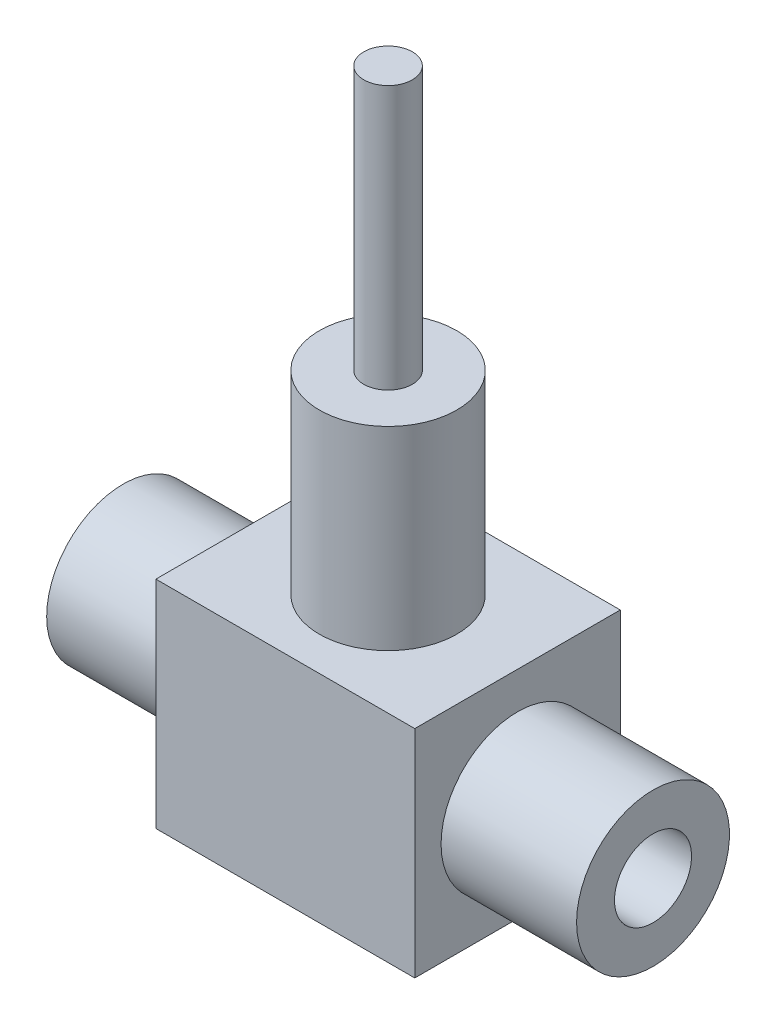
ISO-10303-21;
HEADER;
FILE_DESCRIPTION(('STEP AP214'),'2;1');
FILE_NAME('part.step','',(''),(''),'','','');
FILE_SCHEMA(('AUTOMOTIVE_DESIGN { 1 0 10303 214 1 1 1 1 }'));
ENDSEC;
DATA;
#1=APPLICATION_CONTEXT('core data for automotive mechanical design processes');
#2=APPLICATION_PROTOCOL_DEFINITION('international standard','automotive_design',2000,#1);
#3=PRODUCT_CONTEXT('',#1,'mechanical');
#4=PRODUCT('Part','Part','',(#3));
#5=PRODUCT_RELATED_PRODUCT_CATEGORY('part','',(#4));
#6=PRODUCT_DEFINITION_FORMATION('','',#4);
#7=PRODUCT_DEFINITION_CONTEXT('part definition',#1,'design');
#8=PRODUCT_DEFINITION('design','',#6,#7);
#9=PRODUCT_DEFINITION_SHAPE('','',#8);
#10=(LENGTH_UNIT() NAMED_UNIT(*) SI_UNIT(.MILLI.,.METRE.));
#11=(NAMED_UNIT(*) PLANE_ANGLE_UNIT() SI_UNIT($,.RADIAN.));
#12=(NAMED_UNIT(*) SI_UNIT($,.STERADIAN.) SOLID_ANGLE_UNIT());
#13=UNCERTAINTY_MEASURE_WITH_UNIT(LENGTH_MEASURE(1.E-05),#10,'distance_accuracy_value','');
#14=(GEOMETRIC_REPRESENTATION_CONTEXT(3) GLOBAL_UNCERTAINTY_ASSIGNED_CONTEXT((#13)) GLOBAL_UNIT_ASSIGNED_CONTEXT((#10,
#11,#12)) REPRESENTATION_CONTEXT('',''));
#15=CARTESIAN_POINT('',(0.,0.,0.));
#16=DIRECTION('',(0.,0.,1.));
#17=DIRECTION('',(1.,0.,0.));
#18=AXIS2_PLACEMENT_3D('',#15,#16,#17);
#19=CARTESIAN_POINT('',(-16.,14.,12.7));
#20=DIRECTION('',(1.,0.,0.));
#21=DIRECTION('',(0.,0.,-1.));
#22=AXIS2_PLACEMENT_3D('',#19,#20,#21);
#23=PLANE('',#22);
#24=CARTESIAN_POINT('',(-16.,0.,0.));
#25=DIRECTION('',(-1.,0.,0.));
#26=DIRECTION('',(0.,0.,1.));
#27=AXIS2_PLACEMENT_3D('',#24,#25,#26);
#28=CIRCLE('',#27,9.45);
#29=CARTESIAN_POINT('',(-16.,0.,9.45));
#30=VERTEX_POINT('',#29);
#31=EDGE_CURVE('E11',#30,#30,#28,.T.);
#32=ORIENTED_EDGE('',*,*,#31,.F.);
#33=EDGE_LOOP('',(#32));
#34=FACE_BOUND('',#33,.T.);
#35=DIRECTION('',(0.,-1.,0.));
#36=VECTOR('',#35,1.);
#37=CARTESIAN_POINT('',(-16.,14.,-12.7));
#38=LINE('',#37,#36);
#39=CARTESIAN_POINT('',(-16.,14.,-12.7));
#40=VERTEX_POINT('',#39);
#41=CARTESIAN_POINT('',(-16.,-12.7,-12.7));
#42=VERTEX_POINT('',#41);
#43=EDGE_CURVE('E107',#40,#42,#38,.T.);
#44=ORIENTED_EDGE('',*,*,#43,.T.);
#45=DIRECTION('',(0.,0.,-1.));
#46=VECTOR('',#45,1.);
#47=CARTESIAN_POINT('',(-16.,-12.7,12.7));
#48=LINE('',#47,#46);
#49=CARTESIAN_POINT('',(-16.,-12.7,12.7));
#50=VERTEX_POINT('',#49);
#51=EDGE_CURVE('E49',#50,#42,#48,.T.);
#52=ORIENTED_EDGE('',*,*,#51,.F.);
#53=DIRECTION('',(0.,-1.,0.));
#54=VECTOR('',#53,1.);
#55=CARTESIAN_POINT('',(-16.,14.,12.7));
#56=LINE('',#55,#54);
#57=CARTESIAN_POINT('',(-16.,14.,12.7));
#58=VERTEX_POINT('',#57);
#59=EDGE_CURVE('E93',#58,#50,#56,.T.);
#60=ORIENTED_EDGE('',*,*,#59,.F.);
#61=DIRECTION('',(0.,0.,-1.));
#62=VECTOR('',#61,1.);
#63=CARTESIAN_POINT('',(-16.,14.,12.7));
#64=LINE('',#63,#62);
#65=EDGE_CURVE('E102',#58,#40,#64,.T.);
#66=ORIENTED_EDGE('',*,*,#65,.T.);
#67=EDGE_LOOP('',(#44,#52,#60,#66));
#68=FACE_BOUND('',#67,.T.);
#69=ADVANCED_FACE('F41',(#34,#68),#23,.F.);
#70=CARTESIAN_POINT('',(-16.,-12.7,12.7));
#71=DIRECTION('',(0.,1.,0.));
#72=DIRECTION('',(0.,0.,1.));
#73=AXIS2_PLACEMENT_3D('',#70,#71,#72);
#74=PLANE('',#73);
#75=DIRECTION('',(1.,0.,0.));
#76=VECTOR('',#75,1.);
#77=CARTESIAN_POINT('',(-16.,-12.7,-12.7));
#78=LINE('',#77,#76);
#79=CARTESIAN_POINT('',(16.,-12.7,-12.7));
#80=VERTEX_POINT('',#79);
#81=EDGE_CURVE('E99',#42,#80,#78,.T.);
#82=ORIENTED_EDGE('',*,*,#81,.T.);
#83=DIRECTION('',(0.,0.,-1.));
#84=VECTOR('',#83,1.);
#85=CARTESIAN_POINT('',(16.,-12.7,12.7));
#86=LINE('',#85,#84);
#87=CARTESIAN_POINT('',(16.,-12.7,12.7));
#88=VERTEX_POINT('',#87);
#89=EDGE_CURVE('E96',#88,#80,#86,.T.);
#90=ORIENTED_EDGE('',*,*,#89,.F.);
#91=DIRECTION('',(1.,0.,0.));
#92=VECTOR('',#91,1.);
#93=CARTESIAN_POINT('',(-16.,-12.7,12.7));
#94=LINE('',#93,#92);
#95=EDGE_CURVE('E90',#50,#88,#94,.T.);
#96=ORIENTED_EDGE('',*,*,#95,.F.);
#97=ORIENTED_EDGE('',*,*,#51,.T.);
#98=EDGE_LOOP('',(#82,#90,#96,#97));
#99=FACE_BOUND('',#98,.T.);
#100=ADVANCED_FACE('F100',(#99),#74,.F.);
#101=CARTESIAN_POINT('',(16.,-12.7,12.7));
#102=DIRECTION('',(-1.,0.,0.));
#103=DIRECTION('',(0.,0.,1.));
#104=AXIS2_PLACEMENT_3D('',#101,#102,#103);
#105=PLANE('',#104);
#106=CARTESIAN_POINT('',(16.,0.,0.));
#107=DIRECTION('',(-1.,0.,0.));
#108=DIRECTION('',(0.,0.,1.));
#109=AXIS2_PLACEMENT_3D('',#106,#107,#108);
#110=CIRCLE('',#109,9.45);
#111=CARTESIAN_POINT('',(16.,0.,9.45));
#112=VERTEX_POINT('',#111);
#113=EDGE_CURVE('E123',#112,#112,#110,.T.);
#114=ORIENTED_EDGE('',*,*,#113,.T.);
#115=EDGE_LOOP('',(#114));
#116=FACE_BOUND('',#115,.T.);
#117=DIRECTION('',(0.,1.,0.));
#118=VECTOR('',#117,1.);
#119=CARTESIAN_POINT('',(16.,-12.7,-12.7));
#120=LINE('',#119,#118);
#121=CARTESIAN_POINT('',(16.,14.,-12.7));
#122=VERTEX_POINT('',#121);
#123=EDGE_CURVE('E77',#80,#122,#120,.T.);
#124=ORIENTED_EDGE('',*,*,#123,.T.);
#125=DIRECTION('',(0.,0.,-1.));
#126=VECTOR('',#125,1.);
#127=CARTESIAN_POINT('',(16.,14.,12.7));
#128=LINE('',#127,#126);
#129=CARTESIAN_POINT('',(16.,14.,12.7));
#130=VERTEX_POINT('',#129);
#131=EDGE_CURVE('E103',#130,#122,#128,.T.);
#132=ORIENTED_EDGE('',*,*,#131,.F.);
#133=DIRECTION('',(0.,1.,0.));
#134=VECTOR('',#133,1.);
#135=CARTESIAN_POINT('',(16.,-12.7,12.7));
#136=LINE('',#135,#134);
#137=EDGE_CURVE('E94',#88,#130,#136,.T.);
#138=ORIENTED_EDGE('',*,*,#137,.F.);
#139=ORIENTED_EDGE('',*,*,#89,.T.);
#140=EDGE_LOOP('',(#124,#132,#138,#139));
#141=FACE_BOUND('',#140,.T.);
#142=ADVANCED_FACE('F101',(#116,#141),#105,.F.);
#143=CARTESIAN_POINT('',(16.,14.,12.7));
#144=DIRECTION('',(0.,-1.,0.));
#145=DIRECTION('',(0.,0.,-1.));
#146=AXIS2_PLACEMENT_3D('',#143,#144,#145);
#147=PLANE('',#146);
#148=CARTESIAN_POINT('',(0.,14.,0.));
#149=DIRECTION('',(0.,-1.,0.));
#150=DIRECTION('',(0.,0.,-1.));
#151=AXIS2_PLACEMENT_3D('',#148,#149,#150);
#152=CIRCLE('',#151,8.5);
#153=CARTESIAN_POINT('',(0.,14.,-8.5));
#154=VERTEX_POINT('',#153);
#155=EDGE_CURVE('E185',#154,#154,#152,.T.);
#156=ORIENTED_EDGE('',*,*,#155,.T.);
#157=EDGE_LOOP('',(#156));
#158=FACE_BOUND('',#157,.T.);
#159=DIRECTION('',(-1.,0.,0.));
#160=VECTOR('',#159,1.);
#161=CARTESIAN_POINT('',(16.,14.,-12.7));
#162=LINE('',#161,#160);
#163=EDGE_CURVE('E85',#122,#40,#162,.T.);
#164=ORIENTED_EDGE('',*,*,#163,.T.);
#165=ORIENTED_EDGE('',*,*,#65,.F.);
#166=DIRECTION('',(-1.,0.,0.));
#167=VECTOR('',#166,1.);
#168=CARTESIAN_POINT('',(16.,14.,12.7));
#169=LINE('',#168,#167);
#170=EDGE_CURVE('E56',#130,#58,#169,.T.);
#171=ORIENTED_EDGE('',*,*,#170,.F.);
#172=ORIENTED_EDGE('',*,*,#131,.T.);
#173=EDGE_LOOP('',(#164,#165,#171,#172));
#174=FACE_BOUND('',#173,.T.);
#175=ADVANCED_FACE('F166',(#158,#174),#147,.F.);
#176=CARTESIAN_POINT('',(0.,0.,12.7));
#177=DIRECTION('',(0.,0.,1.));
#178=DIRECTION('',(1.,0.,0.));
#179=AXIS2_PLACEMENT_3D('',#176,#177,#178);
#180=PLANE('',#179);
#181=ORIENTED_EDGE('',*,*,#59,.T.);
#182=ORIENTED_EDGE('',*,*,#95,.T.);
#183=ORIENTED_EDGE('',*,*,#137,.T.);
#184=ORIENTED_EDGE('',*,*,#170,.T.);
#185=EDGE_LOOP('',(#181,#182,#183,#184));
#186=FACE_BOUND('',#185,.T.);
#187=ADVANCED_FACE('F92',(#186),#180,.T.);
#188=CARTESIAN_POINT('',(0.,0.,-12.7));
#189=DIRECTION('',(0.,0.,1.));
#190=DIRECTION('',(1.,0.,0.));
#191=AXIS2_PLACEMENT_3D('',#188,#189,#190);
#192=PLANE('',#191);
#193=ORIENTED_EDGE('',*,*,#43,.F.);
#194=ORIENTED_EDGE('',*,*,#163,.F.);
#195=ORIENTED_EDGE('',*,*,#123,.F.);
#196=ORIENTED_EDGE('',*,*,#81,.F.);
#197=EDGE_LOOP('',(#193,#194,#195,#196));
#198=FACE_BOUND('',#197,.T.);
#199=ADVANCED_FACE('F143',(#198),#192,.F.);
#200=CARTESIAN_POINT('',(32.75,0.,0.));
#201=DIRECTION('',(-1.,0.,0.));
#202=DIRECTION('',(0.,0.,1.));
#203=AXIS2_PLACEMENT_3D('',#200,#201,#202);
#204=PLANE('',#203);
#205=CARTESIAN_POINT('',(32.7500000000001,0.,0.));
#206=DIRECTION('',(-1.,0.,0.));
#207=DIRECTION('',(0.,0.,1.));
#208=AXIS2_PLACEMENT_3D('',#205,#206,#207);
#209=CIRCLE('',#208,4.7625);
#210=CARTESIAN_POINT('',(32.7500000000001,0.,4.7625));
#211=VERTEX_POINT('',#210);
#212=EDGE_CURVE('E117',#211,#211,#209,.F.);
#213=ORIENTED_EDGE('',*,*,#212,.F.);
#214=EDGE_LOOP('',(#213));
#215=FACE_BOUND('',#214,.T.);
#216=CARTESIAN_POINT('',(32.7500000000001,0.,0.));
#217=DIRECTION('',(-1.,0.,0.));
#218=DIRECTION('',(0.,0.,1.));
#219=AXIS2_PLACEMENT_3D('',#216,#217,#218);
#220=CIRCLE('',#219,9.45);
#221=CARTESIAN_POINT('',(32.7500000000001,0.,9.45));
#222=VERTEX_POINT('',#221);
#223=EDGE_CURVE('E115',#222,#222,#220,.T.);
#224=ORIENTED_EDGE('',*,*,#223,.F.);
#225=EDGE_LOOP('',(#224));
#226=FACE_BOUND('',#225,.T.);
#227=ADVANCED_FACE('F141',(#215,#226),#204,.F.);
#228=CARTESIAN_POINT('',(-1000.,0.,0.));
#229=DIRECTION('',(-1.,0.,0.));
#230=DIRECTION('',(0.,0.,1.));
#231=AXIS2_PLACEMENT_3D('',#228,#229,#230);
#232=CYLINDRICAL_SURFACE('',#231,9.45);
#233=ORIENTED_EDGE('',*,*,#113,.F.);
#234=EDGE_LOOP('',(#233));
#235=FACE_BOUND('',#234,.T.);
#236=ORIENTED_EDGE('',*,*,#223,.T.);
#237=EDGE_LOOP('',(#236));
#238=FACE_BOUND('',#237,.T.);
#239=ADVANCED_FACE('F142',(#235,#238),#232,.T.);
#240=CARTESIAN_POINT('',(-32.75,9.45,0.));
#241=DIRECTION('',(1.,0.,0.));
#242=DIRECTION('',(0.,0.,-1.));
#243=AXIS2_PLACEMENT_3D('',#240,#241,#242);
#244=PLANE('',#243);
#245=CARTESIAN_POINT('',(-32.7500000000001,0.,0.));
#246=DIRECTION('',(1.,0.,0.));
#247=DIRECTION('',(0.,0.,-1.));
#248=AXIS2_PLACEMENT_3D('',#245,#246,#247);
#249=CIRCLE('',#248,4.7625);
#250=CARTESIAN_POINT('',(-32.7500000000001,0.,-4.7625));
#251=VERTEX_POINT('',#250);
#252=EDGE_CURVE('E42',#251,#251,#249,.F.);
#253=ORIENTED_EDGE('',*,*,#252,.F.);
#254=EDGE_LOOP('',(#253));
#255=FACE_BOUND('',#254,.T.);
#256=CARTESIAN_POINT('',(-32.7500000000001,0.,0.));
#257=DIRECTION('',(-1.,0.,0.));
#258=DIRECTION('',(0.,0.,1.));
#259=AXIS2_PLACEMENT_3D('',#256,#257,#258);
#260=CIRCLE('',#259,9.45);
#261=CARTESIAN_POINT('',(-32.7500000000001,0.,9.45));
#262=VERTEX_POINT('',#261);
#263=EDGE_CURVE('E119',#262,#262,#260,.T.);
#264=ORIENTED_EDGE('',*,*,#263,.T.);
#265=EDGE_LOOP('',(#264));
#266=FACE_BOUND('',#265,.T.);
#267=ADVANCED_FACE('F154',(#255,#266),#244,.F.);
#268=CARTESIAN_POINT('',(-1000.,0.,0.));
#269=DIRECTION('',(-1.,0.,0.));
#270=DIRECTION('',(0.,0.,1.));
#271=AXIS2_PLACEMENT_3D('',#268,#269,#270);
#272=CYLINDRICAL_SURFACE('',#271,9.45);
#273=ORIENTED_EDGE('',*,*,#263,.F.);
#274=EDGE_LOOP('',(#273));
#275=FACE_BOUND('',#274,.T.);
#276=ORIENTED_EDGE('',*,*,#31,.T.);
#277=EDGE_LOOP('',(#276));
#278=FACE_BOUND('',#277,.T.);
#279=ADVANCED_FACE('F221',(#275,#278),#272,.T.);
#280=CARTESIAN_POINT('',(-1000.,0.,0.));
#281=DIRECTION('',(-1.,0.,0.));
#282=DIRECTION('',(0.,0.,1.));
#283=AXIS2_PLACEMENT_3D('',#280,#281,#282);
#284=CYLINDRICAL_SURFACE('',#283,4.7625);
#285=CARTESIAN_POINT('',(15.9499999999999,0.,0.));
#286=DIRECTION('',(-1.,0.,0.));
#287=DIRECTION('',(0.,0.,1.));
#288=AXIS2_PLACEMENT_3D('',#285,#286,#287);
#289=CIRCLE('',#288,4.7625);
#290=CARTESIAN_POINT('',(15.9499999999999,0.,4.7625));
#291=VERTEX_POINT('',#290);
#292=EDGE_CURVE('E122',#291,#291,#289,.T.);
#293=ORIENTED_EDGE('',*,*,#292,.T.);
#294=EDGE_LOOP('',(#293));
#295=FACE_BOUND('',#294,.T.);
#296=ORIENTED_EDGE('',*,*,#212,.T.);
#297=EDGE_LOOP('',(#296));
#298=FACE_BOUND('',#297,.T.);
#299=ADVANCED_FACE('F225',(#295,#298),#284,.F.);
#300=CARTESIAN_POINT('',(15.95,4.7625,0.));
#301=DIRECTION('',(1.,0.,0.));
#302=DIRECTION('',(0.,0.,-1.));
#303=AXIS2_PLACEMENT_3D('',#300,#301,#302);
#304=PLANE('',#303);
#305=ORIENTED_EDGE('',*,*,#292,.F.);
#306=EDGE_LOOP('',(#305));
#307=FACE_BOUND('',#306,.T.);
#308=ADVANCED_FACE('F219',(#307),#304,.T.);
#309=CARTESIAN_POINT('',(-1000.,0.,0.));
#310=DIRECTION('',(-1.,0.,0.));
#311=DIRECTION('',(0.,0.,1.));
#312=AXIS2_PLACEMENT_3D('',#309,#310,#311);
#313=CYLINDRICAL_SURFACE('',#312,4.7625);
#314=CARTESIAN_POINT('',(-15.95,0.,0.));
#315=DIRECTION('',(-1.,0.,0.));
#316=DIRECTION('',(0.,0.,1.));
#317=AXIS2_PLACEMENT_3D('',#314,#315,#316);
#318=CIRCLE('',#317,4.7625);
#319=CARTESIAN_POINT('',(-15.95,0.,4.7625));
#320=VERTEX_POINT('',#319);
#321=EDGE_CURVE('E132',#320,#320,#318,.T.);
#322=ORIENTED_EDGE('',*,*,#321,.F.);
#323=EDGE_LOOP('',(#322));
#324=FACE_BOUND('',#323,.T.);
#325=ORIENTED_EDGE('',*,*,#252,.T.);
#326=EDGE_LOOP('',(#325));
#327=FACE_BOUND('',#326,.T.);
#328=ADVANCED_FACE('F213',(#324,#327),#313,.F.);
#329=CARTESIAN_POINT('',(-15.95,0.,0.));
#330=DIRECTION('',(-1.,0.,0.));
#331=DIRECTION('',(0.,0.,1.));
#332=AXIS2_PLACEMENT_3D('',#329,#330,#331);
#333=PLANE('',#332);
#334=ORIENTED_EDGE('',*,*,#321,.T.);
#335=EDGE_LOOP('',(#334));
#336=FACE_BOUND('',#335,.T.);
#337=ADVANCED_FACE('F214',(#336),#333,.T.);
#338=CARTESIAN_POINT('',(0.,-500.,0.));
#339=DIRECTION('',(0.,-1.,0.));
#340=DIRECTION('',(0.,0.,-1.));
#341=AXIS2_PLACEMENT_3D('',#338,#339,#340);
#342=CYLINDRICAL_SURFACE('',#341,8.5);
#343=CARTESIAN_POINT('',(0.,38.,0.));
#344=DIRECTION('',(0.,-1.,0.));
#345=DIRECTION('',(0.,0.,-1.));
#346=AXIS2_PLACEMENT_3D('',#343,#344,#345);
#347=CIRCLE('',#346,8.5);
#348=CARTESIAN_POINT('',(0.,38.,-8.5));
#349=VERTEX_POINT('',#348);
#350=EDGE_CURVE('E183',#349,#349,#347,.T.);
#351=ORIENTED_EDGE('',*,*,#350,.T.);
#352=EDGE_LOOP('',(#351));
#353=FACE_BOUND('',#352,.T.);
#354=ORIENTED_EDGE('',*,*,#155,.F.);
#355=EDGE_LOOP('',(#354));
#356=FACE_BOUND('',#355,.T.);
#357=ADVANCED_FACE('F208',(#353,#356),#342,.T.);
#358=CARTESIAN_POINT('',(8.5,38.,0.));
#359=DIRECTION('',(0.,1.,0.));
#360=DIRECTION('',(0.,0.,1.));
#361=AXIS2_PLACEMENT_3D('',#358,#359,#360);
#362=PLANE('',#361);
#363=CARTESIAN_POINT('',(0.,38.,0.));
#364=DIRECTION('',(0.,-1.,0.));
#365=DIRECTION('',(0.,0.,-1.));
#366=AXIS2_PLACEMENT_3D('',#363,#364,#365);
#367=CIRCLE('',#366,3.);
#368=CARTESIAN_POINT('',(0.,38.,-3.));
#369=VERTEX_POINT('',#368);
#370=EDGE_CURVE('E190',#369,#369,#367,.T.);
#371=ORIENTED_EDGE('',*,*,#370,.T.);
#372=EDGE_LOOP('',(#371));
#373=FACE_BOUND('',#372,.T.);
#374=ORIENTED_EDGE('',*,*,#350,.F.);
#375=EDGE_LOOP('',(#374));
#376=FACE_BOUND('',#375,.T.);
#377=ADVANCED_FACE('F203',(#373,#376),#362,.T.);
#378=CARTESIAN_POINT('',(0.,-500.,0.));
#379=DIRECTION('',(0.,-1.,0.));
#380=DIRECTION('',(0.,0.,-1.));
#381=AXIS2_PLACEMENT_3D('',#378,#379,#380);
#382=CYLINDRICAL_SURFACE('',#381,3.);
#383=CARTESIAN_POINT('',(0.,70.6,0.));
#384=DIRECTION('',(0.,-1.,0.));
#385=DIRECTION('',(0.,0.,-1.));
#386=AXIS2_PLACEMENT_3D('',#383,#384,#385);
#387=CIRCLE('',#386,3.);
#388=CARTESIAN_POINT('',(0.,70.6,-3.));
#389=VERTEX_POINT('',#388);
#390=EDGE_CURVE('E195',#389,#389,#387,.T.);
#391=ORIENTED_EDGE('',*,*,#390,.T.);
#392=EDGE_LOOP('',(#391));
#393=FACE_BOUND('',#392,.T.);
#394=ORIENTED_EDGE('',*,*,#370,.F.);
#395=EDGE_LOOP('',(#394));
#396=FACE_BOUND('',#395,.T.);
#397=ADVANCED_FACE('F196',(#393,#396),#382,.T.);
#398=CARTESIAN_POINT('',(3.,70.6,0.));
#399=DIRECTION('',(0.,1.,0.));
#400=DIRECTION('',(0.,0.,1.));
#401=AXIS2_PLACEMENT_3D('',#398,#399,#400);
#402=PLANE('',#401);
#403=ORIENTED_EDGE('',*,*,#390,.F.);
#404=EDGE_LOOP('',(#403));
#405=FACE_BOUND('',#404,.T.);
#406=ADVANCED_FACE('F198',(#405),#402,.T.);
#407=CLOSED_SHELL('',(#69,#100,#142,#175,#187,#199,#227,#239,#267,#279,#299,#308,#328,#337,#357,
#377,#397,#406));
#408=MANIFOLD_SOLID_BREP('B2',#407);
#409=ADVANCED_BREP_SHAPE_REPRESENTATION('',(#18,#408),#14);
#410=SHAPE_DEFINITION_REPRESENTATION(#9,#409);
ENDSEC;
END-ISO-10303-21;
